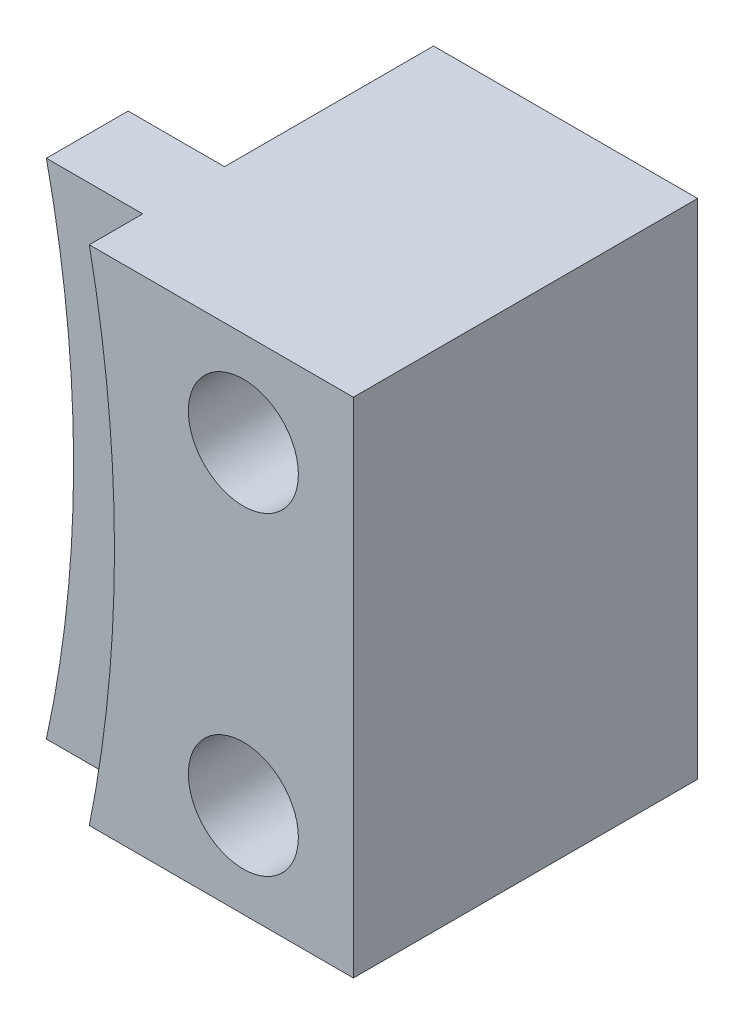
ISO-10303-21;
HEADER;
FILE_DESCRIPTION(('STEP AP214'),'2;1');
FILE_NAME('part.step','',(''),(''),'','','');
FILE_SCHEMA(('AUTOMOTIVE_DESIGN { 1 0 10303 214 1 1 1 1 }'));
ENDSEC;
DATA;
#1=APPLICATION_CONTEXT('core data for automotive mechanical design processes');
#2=APPLICATION_PROTOCOL_DEFINITION('international standard','automotive_design',2000,#1);
#3=PRODUCT_CONTEXT('',#1,'mechanical');
#4=PRODUCT('Part','Part','',(#3));
#5=PRODUCT_RELATED_PRODUCT_CATEGORY('part','',(#4));
#6=PRODUCT_DEFINITION_FORMATION('','',#4);
#7=PRODUCT_DEFINITION_CONTEXT('part definition',#1,'design');
#8=PRODUCT_DEFINITION('design','',#6,#7);
#9=PRODUCT_DEFINITION_SHAPE('','',#8);
#10=(LENGTH_UNIT() NAMED_UNIT(*) SI_UNIT(.MILLI.,.METRE.));
#11=(NAMED_UNIT(*) PLANE_ANGLE_UNIT() SI_UNIT($,.RADIAN.));
#12=(NAMED_UNIT(*) SI_UNIT($,.STERADIAN.) SOLID_ANGLE_UNIT());
#13=UNCERTAINTY_MEASURE_WITH_UNIT(LENGTH_MEASURE(1.E-05),#10,'distance_accuracy_value','');
#14=(GEOMETRIC_REPRESENTATION_CONTEXT(3) GLOBAL_UNCERTAINTY_ASSIGNED_CONTEXT((#13)) GLOBAL_UNIT_ASSIGNED_CONTEXT((#10,
#11,#12)) REPRESENTATION_CONTEXT('',''));
#15=CARTESIAN_POINT('',(0.,0.,0.));
#16=DIRECTION('',(0.,0.,1.));
#17=DIRECTION('',(1.,0.,0.));
#18=AXIS2_PLACEMENT_3D('',#15,#16,#17);
#19=CARTESIAN_POINT('',(44.5,5.,46.));
#20=DIRECTION('',(0.,0.,1.));
#21=DIRECTION('',(1.,0.,0.));
#22=AXIS2_PLACEMENT_3D('',#19,#20,#21);
#23=CYLINDRICAL_SURFACE('',#22,1.75);
#24=DIRECTION('',(0.,0.,1.));
#25=VECTOR('',#24,1.);
#26=CARTESIAN_POINT('',(46.25,5.,46.));
#27=LINE('',#26,#25);
#28=CARTESIAN_POINT('',(46.25,5.,46.05));
#29=VERTEX_POINT('',#28);
#30=CARTESIAN_POINT('',(46.25,5.,57.));
#31=VERTEX_POINT('',#30);
#32=EDGE_CURVE('E10',#29,#31,#27,.T.);
#33=ORIENTED_EDGE('',*,*,#32,.F.);
#34=CARTESIAN_POINT('',(44.5,5.,46.05));
#35=DIRECTION('',(0.,0.,1.));
#36=DIRECTION('',(1.,0.,0.));
#37=AXIS2_PLACEMENT_3D('',#34,#35,#36);
#38=CIRCLE('',#37,1.75);
#39=EDGE_CURVE('E183',#29,#29,#38,.T.);
#40=ORIENTED_EDGE('',*,*,#39,.F.);
#41=ORIENTED_EDGE('',*,*,#32,.T.);
#42=CARTESIAN_POINT('',(44.5,5.,57.));
#43=DIRECTION('',(0.,0.,1.));
#44=DIRECTION('',(1.,0.,0.));
#45=AXIS2_PLACEMENT_3D('',#42,#43,#44);
#46=CIRCLE('',#45,1.75);
#47=EDGE_CURVE('E226',#31,#31,#46,.T.);
#48=ORIENTED_EDGE('',*,*,#47,.T.);
#49=EDGE_LOOP('',(#33,#40,#41,#48));
#50=FACE_BOUND('',#49,.T.);
#51=ADVANCED_FACE('F15',(#50),#23,.F.);
#52=CARTESIAN_POINT('',(44.5,-5.,46.));
#53=DIRECTION('',(0.,0.,1.));
#54=DIRECTION('',(1.,0.,0.));
#55=AXIS2_PLACEMENT_3D('',#52,#53,#54);
#56=CYLINDRICAL_SURFACE('',#55,1.75);
#57=DIRECTION('',(0.,0.,1.));
#58=VECTOR('',#57,1.);
#59=CARTESIAN_POINT('',(46.25,-5.,46.));
#60=LINE('',#59,#58);
#61=CARTESIAN_POINT('',(46.25,-5.,46.05));
#62=VERTEX_POINT('',#61);
#63=CARTESIAN_POINT('',(46.25,-5.,57.));
#64=VERTEX_POINT('',#63);
#65=EDGE_CURVE('E18',#62,#64,#60,.T.);
#66=ORIENTED_EDGE('',*,*,#65,.F.);
#67=CARTESIAN_POINT('',(44.5,-5.,46.05));
#68=DIRECTION('',(0.,0.,1.));
#69=DIRECTION('',(1.,0.,0.));
#70=AXIS2_PLACEMENT_3D('',#67,#68,#69);
#71=CIRCLE('',#70,1.75);
#72=EDGE_CURVE('E177',#62,#62,#71,.T.);
#73=ORIENTED_EDGE('',*,*,#72,.F.);
#74=ORIENTED_EDGE('',*,*,#65,.T.);
#75=CARTESIAN_POINT('',(44.5,-5.,57.));
#76=DIRECTION('',(0.,0.,1.));
#77=DIRECTION('',(1.,0.,0.));
#78=AXIS2_PLACEMENT_3D('',#75,#76,#77);
#79=CIRCLE('',#78,1.75);
#80=EDGE_CURVE('E223',#64,#64,#79,.T.);
#81=ORIENTED_EDGE('',*,*,#80,.T.);
#82=EDGE_LOOP('',(#66,#73,#74,#81));
#83=FACE_BOUND('',#82,.T.);
#84=ADVANCED_FACE('F307',(#83),#56,.F.);
#85=CARTESIAN_POINT('',(38.,8.,46.05));
#86=DIRECTION('',(0.,1.,0.));
#87=DIRECTION('',(1.,0.,0.));
#88=AXIS2_PLACEMENT_3D('',#85,#86,#87);
#89=PLANE('',#88);
#90=DIRECTION('',(1.,0.,0.));
#91=VECTOR('',#90,1.);
#92=CARTESIAN_POINT('',(38.,8.,46.05));
#93=LINE('',#92,#91);
#94=CARTESIAN_POINT('',(39.6,8.,46.05));
#95=VERTEX_POINT('',#94);
#96=CARTESIAN_POINT('',(48.,8.,46.05));
#97=VERTEX_POINT('',#96);
#98=EDGE_CURVE('E124',#95,#97,#93,.T.);
#99=ORIENTED_EDGE('',*,*,#98,.F.);
#100=DIRECTION('',(0.,0.,1.));
#101=VECTOR('',#100,1.);
#102=CARTESIAN_POINT('',(39.6,8.,46.));
#103=LINE('',#102,#101);
#104=CARTESIAN_POINT('',(39.6,8.,52.7));
#105=VERTEX_POINT('',#104);
#106=EDGE_CURVE('E160',#95,#105,#103,.T.);
#107=ORIENTED_EDGE('',*,*,#106,.T.);
#108=DIRECTION('',(1.,0.,0.));
#109=VECTOR('',#108,1.);
#110=CARTESIAN_POINT('',(30.,8.,52.7));
#111=LINE('',#110,#109);
#112=CARTESIAN_POINT('',(36.53436738196,8.,52.7));
#113=VERTEX_POINT('',#112);
#114=EDGE_CURVE('E192',#113,#105,#111,.T.);
#115=ORIENTED_EDGE('',*,*,#114,.F.);
#116=DIRECTION('',(0.,0.,1.));
#117=VECTOR('',#116,1.);
#118=CARTESIAN_POINT('',(36.53436738196,8.,51.7));
#119=LINE('',#118,#117);
#120=CARTESIAN_POINT('',(36.53436738196,8.,55.3));
#121=VERTEX_POINT('',#120);
#122=EDGE_CURVE('E174',#113,#121,#119,.T.);
#123=ORIENTED_EDGE('',*,*,#122,.T.);
#124=DIRECTION('',(1.,0.,0.));
#125=VECTOR('',#124,1.);
#126=CARTESIAN_POINT('',(30.,8.,55.3));
#127=LINE('',#126,#125);
#128=CARTESIAN_POINT('',(39.6,8.,55.3));
#129=VERTEX_POINT('',#128);
#130=EDGE_CURVE('E173',#121,#129,#127,.T.);
#131=ORIENTED_EDGE('',*,*,#130,.T.);
#132=DIRECTION('',(0.,0.,1.));
#133=VECTOR('',#132,1.);
#134=CARTESIAN_POINT('',(39.6,8.,46.));
#135=LINE('',#134,#133);
#136=CARTESIAN_POINT('',(39.6,8.,57.));
#137=VERTEX_POINT('',#136);
#138=EDGE_CURVE('E213',#129,#137,#135,.T.);
#139=ORIENTED_EDGE('',*,*,#138,.T.);
#140=DIRECTION('',(1.,0.,0.));
#141=VECTOR('',#140,1.);
#142=CARTESIAN_POINT('',(38.,8.,57.));
#143=LINE('',#142,#141);
#144=CARTESIAN_POINT('',(48.,8.,57.));
#145=VERTEX_POINT('',#144);
#146=EDGE_CURVE('E217',#137,#145,#143,.T.);
#147=ORIENTED_EDGE('',*,*,#146,.T.);
#148=DIRECTION('',(0.,0.,1.));
#149=VECTOR('',#148,1.);
#150=CARTESIAN_POINT('',(48.,8.,46.05));
#151=LINE('',#150,#149);
#152=EDGE_CURVE('E228',#97,#145,#151,.T.);
#153=ORIENTED_EDGE('',*,*,#152,.F.);
#154=EDGE_LOOP('',(#99,#107,#115,#123,#131,#139,#147,#153));
#155=FACE_BOUND('',#154,.T.);
#156=ADVANCED_FACE('F312',(#155),#89,.T.);
#157=CARTESIAN_POINT('',(48.,-8.,46.05));
#158=DIRECTION('',(1.,0.,0.));
#159=DIRECTION('',(0.,1.,0.));
#160=AXIS2_PLACEMENT_3D('',#157,#158,#159);
#161=PLANE('',#160);
#162=DIRECTION('',(0.,0.,1.));
#163=VECTOR('',#162,1.);
#164=CARTESIAN_POINT('',(48.,-8.,46.05));
#165=LINE('',#164,#163);
#166=CARTESIAN_POINT('',(48.,-8.,46.05));
#167=VERTEX_POINT('',#166);
#168=CARTESIAN_POINT('',(48.,-8.,57.));
#169=VERTEX_POINT('',#168);
#170=EDGE_CURVE('E134',#167,#169,#165,.T.);
#171=ORIENTED_EDGE('',*,*,#170,.F.);
#172=DIRECTION('',(0.,1.,0.));
#173=VECTOR('',#172,1.);
#174=CARTESIAN_POINT('',(48.,-8.,46.05));
#175=LINE('',#174,#173);
#176=EDGE_CURVE('E117',#167,#97,#175,.T.);
#177=ORIENTED_EDGE('',*,*,#176,.T.);
#178=ORIENTED_EDGE('',*,*,#152,.T.);
#179=DIRECTION('',(0.,1.,0.));
#180=VECTOR('',#179,1.);
#181=CARTESIAN_POINT('',(48.,-8.,57.));
#182=LINE('',#181,#180);
#183=EDGE_CURVE('E142',#169,#145,#182,.T.);
#184=ORIENTED_EDGE('',*,*,#183,.F.);
#185=EDGE_LOOP('',(#171,#177,#178,#184));
#186=FACE_BOUND('',#185,.T.);
#187=ADVANCED_FACE('F140',(#186),#161,.T.);
#188=CARTESIAN_POINT('',(38.,-8.,57.));
#189=DIRECTION('',(0.,0.,1.));
#190=DIRECTION('',(1.,0.,0.));
#191=AXIS2_PLACEMENT_3D('',#188,#189,#190);
#192=PLANE('',#191);
#193=ORIENTED_EDGE('',*,*,#47,.F.);
#194=EDGE_LOOP('',(#193));
#195=FACE_BOUND('',#194,.T.);
#196=ORIENTED_EDGE('',*,*,#80,.F.);
#197=EDGE_LOOP('',(#196));
#198=FACE_BOUND('',#197,.T.);
#199=ORIENTED_EDGE('',*,*,#146,.F.);
#200=CARTESIAN_POINT('',(0.,0.,57.));
#201=DIRECTION('',(0.,0.,-1.));
#202=DIRECTION('',(0.980198019802019,0.198019801980004,0.));
#203=AXIS2_PLACEMENT_3D('',#200,#201,#202);
#204=CIRCLE('',#203,40.4);
#205=CARTESIAN_POINT('',(39.6,-8.,57.));
#206=VERTEX_POINT('',#205);
#207=EDGE_CURVE('E210',#137,#206,#204,.T.);
#208=ORIENTED_EDGE('',*,*,#207,.T.);
#209=DIRECTION('',(1.,0.,0.));
#210=VECTOR('',#209,1.);
#211=CARTESIAN_POINT('',(38.,-8.,57.));
#212=LINE('',#211,#210);
#213=EDGE_CURVE('E145',#206,#169,#212,.T.);
#214=ORIENTED_EDGE('',*,*,#213,.T.);
#215=ORIENTED_EDGE('',*,*,#183,.T.);
#216=EDGE_LOOP('',(#199,#208,#214,#215));
#217=FACE_BOUND('',#216,.T.);
#218=ADVANCED_FACE('F290',(#195,#198,#217),#192,.T.);
#219=CARTESIAN_POINT('',(0.,0.,46.));
#220=DIRECTION('',(0.,0.,1.));
#221=DIRECTION('',(1.,0.,0.));
#222=AXIS2_PLACEMENT_3D('',#219,#220,#221);
#223=CYLINDRICAL_SURFACE('',#222,40.4);
#224=ORIENTED_EDGE('',*,*,#207,.F.);
#225=ORIENTED_EDGE('',*,*,#138,.F.);
#226=CARTESIAN_POINT('',(0.,0.,55.3));
#227=DIRECTION('',(0.,0.,1.));
#228=DIRECTION('',(1.,0.,0.));
#229=AXIS2_PLACEMENT_3D('',#226,#227,#228);
#230=CIRCLE('',#229,40.4);
#231=CARTESIAN_POINT('',(39.6,-8.,55.3));
#232=VERTEX_POINT('',#231);
#233=EDGE_CURVE('E169',#232,#129,#230,.T.);
#234=ORIENTED_EDGE('',*,*,#233,.F.);
#235=DIRECTION('',(0.,0.,1.));
#236=VECTOR('',#235,1.);
#237=CARTESIAN_POINT('',(39.6,-8.,46.));
#238=LINE('',#237,#236);
#239=EDGE_CURVE('E150',#232,#206,#238,.T.);
#240=ORIENTED_EDGE('',*,*,#239,.T.);
#241=EDGE_LOOP('',(#224,#225,#234,#240));
#242=FACE_BOUND('',#241,.T.);
#243=ADVANCED_FACE('F284',(#242),#223,.F.);
#244=CARTESIAN_POINT('',(0.,0.,55.3));
#245=DIRECTION('',(0.,0.,1.));
#246=DIRECTION('',(1.,0.,0.));
#247=AXIS2_PLACEMENT_3D('',#244,#245,#246);
#248=PLANE('',#247);
#249=DIRECTION('',(1.,0.,0.));
#250=VECTOR('',#249,1.);
#251=CARTESIAN_POINT('',(30.,-8.,55.3));
#252=LINE('',#251,#250);
#253=CARTESIAN_POINT('',(36.53436738196,-8.,55.3));
#254=VERTEX_POINT('',#253);
#255=EDGE_CURVE('E158',#254,#232,#252,.T.);
#256=ORIENTED_EDGE('',*,*,#255,.T.);
#257=ORIENTED_EDGE('',*,*,#233,.T.);
#258=ORIENTED_EDGE('',*,*,#130,.F.);
#259=CARTESIAN_POINT('',(0.,0.,55.3));
#260=DIRECTION('',(0.,0.,-1.));
#261=DIRECTION('',(0.976854742833037,0.213903743316008,0.));
#262=AXIS2_PLACEMENT_3D('',#259,#260,#261);
#263=CIRCLE('',#262,37.4);
#264=EDGE_CURVE('E201',#121,#254,#263,.T.);
#265=ORIENTED_EDGE('',*,*,#264,.T.);
#266=EDGE_LOOP('',(#256,#257,#258,#265));
#267=FACE_BOUND('',#266,.T.);
#268=ADVANCED_FACE('F275',(#267),#248,.T.);
#269=CARTESIAN_POINT('',(0.,0.,51.7));
#270=DIRECTION('',(0.,0.,1.));
#271=DIRECTION('',(1.,0.,0.));
#272=AXIS2_PLACEMENT_3D('',#269,#270,#271);
#273=CYLINDRICAL_SURFACE('',#272,37.4);
#274=DIRECTION('',(0.,0.,1.));
#275=VECTOR('',#274,1.);
#276=CARTESIAN_POINT('',(36.53436738196,-8.,51.7));
#277=LINE('',#276,#275);
#278=CARTESIAN_POINT('',(36.53436738196,-8.,52.7));
#279=VERTEX_POINT('',#278);
#280=EDGE_CURVE('E155',#279,#254,#277,.T.);
#281=ORIENTED_EDGE('',*,*,#280,.T.);
#282=ORIENTED_EDGE('',*,*,#264,.F.);
#283=ORIENTED_EDGE('',*,*,#122,.F.);
#284=CARTESIAN_POINT('',(0.,0.,52.7));
#285=DIRECTION('',(0.,0.,1.));
#286=DIRECTION('',(0.976854742833037,-0.213903743316008,0.));
#287=AXIS2_PLACEMENT_3D('',#284,#285,#286);
#288=CIRCLE('',#287,37.4);
#289=EDGE_CURVE('E164',#279,#113,#288,.T.);
#290=ORIENTED_EDGE('',*,*,#289,.F.);
#291=EDGE_LOOP('',(#281,#282,#283,#290));
#292=FACE_BOUND('',#291,.T.);
#293=ADVANCED_FACE('F242',(#292),#273,.F.);
#294=CARTESIAN_POINT('',(0.,0.,52.7));
#295=DIRECTION('',(0.,0.,1.));
#296=DIRECTION('',(1.,0.,0.));
#297=AXIS2_PLACEMENT_3D('',#294,#295,#296);
#298=PLANE('',#297);
#299=ORIENTED_EDGE('',*,*,#289,.T.);
#300=ORIENTED_EDGE('',*,*,#114,.T.);
#301=CARTESIAN_POINT('',(0.,0.,52.7));
#302=DIRECTION('',(0.,0.,1.));
#303=DIRECTION('',(1.,0.,0.));
#304=AXIS2_PLACEMENT_3D('',#301,#302,#303);
#305=CIRCLE('',#304,40.4);
#306=CARTESIAN_POINT('',(39.6,-8.,52.7));
#307=VERTEX_POINT('',#306);
#308=EDGE_CURVE('E165',#307,#105,#305,.T.);
#309=ORIENTED_EDGE('',*,*,#308,.F.);
#310=DIRECTION('',(1.,0.,0.));
#311=VECTOR('',#310,1.);
#312=CARTESIAN_POINT('',(30.,-8.,52.7));
#313=LINE('',#312,#311);
#314=EDGE_CURVE('E153',#279,#307,#313,.T.);
#315=ORIENTED_EDGE('',*,*,#314,.F.);
#316=EDGE_LOOP('',(#299,#300,#309,#315));
#317=FACE_BOUND('',#316,.T.);
#318=ADVANCED_FACE('F236',(#317),#298,.F.);
#319=CARTESIAN_POINT('',(0.,0.,46.));
#320=DIRECTION('',(0.,0.,1.));
#321=DIRECTION('',(1.,0.,0.));
#322=AXIS2_PLACEMENT_3D('',#319,#320,#321);
#323=CYLINDRICAL_SURFACE('',#322,40.4);
#324=ORIENTED_EDGE('',*,*,#308,.T.);
#325=ORIENTED_EDGE('',*,*,#106,.F.);
#326=CARTESIAN_POINT('',(0.,0.,46.05));
#327=DIRECTION('',(0.,0.,1.));
#328=DIRECTION('',(0.980198019802019,-0.198019801980004,0.));
#329=AXIS2_PLACEMENT_3D('',#326,#327,#328);
#330=CIRCLE('',#329,40.4);
#331=CARTESIAN_POINT('',(39.6,-8.,46.05));
#332=VERTEX_POINT('',#331);
#333=EDGE_CURVE('E128',#332,#95,#330,.T.);
#334=ORIENTED_EDGE('',*,*,#333,.F.);
#335=DIRECTION('',(0.,0.,1.));
#336=VECTOR('',#335,1.);
#337=CARTESIAN_POINT('',(39.6,-8.,46.));
#338=LINE('',#337,#336);
#339=EDGE_CURVE('E137',#332,#307,#338,.T.);
#340=ORIENTED_EDGE('',*,*,#339,.T.);
#341=EDGE_LOOP('',(#324,#325,#334,#340));
#342=FACE_BOUND('',#341,.T.);
#343=ADVANCED_FACE('F241',(#342),#323,.F.);
#344=CARTESIAN_POINT('',(38.,-8.,46.05));
#345=DIRECTION('',(0.,0.,1.));
#346=DIRECTION('',(1.,0.,0.));
#347=AXIS2_PLACEMENT_3D('',#344,#345,#346);
#348=PLANE('',#347);
#349=ORIENTED_EDGE('',*,*,#39,.T.);
#350=EDGE_LOOP('',(#349));
#351=FACE_BOUND('',#350,.T.);
#352=ORIENTED_EDGE('',*,*,#72,.T.);
#353=EDGE_LOOP('',(#352));
#354=FACE_BOUND('',#353,.T.);
#355=ORIENTED_EDGE('',*,*,#176,.F.);
#356=DIRECTION('',(1.,0.,0.));
#357=VECTOR('',#356,1.);
#358=CARTESIAN_POINT('',(38.,-8.,46.05));
#359=LINE('',#358,#357);
#360=EDGE_CURVE('E121',#332,#167,#359,.T.);
#361=ORIENTED_EDGE('',*,*,#360,.F.);
#362=ORIENTED_EDGE('',*,*,#333,.T.);
#363=ORIENTED_EDGE('',*,*,#98,.T.);
#364=EDGE_LOOP('',(#355,#361,#362,#363));
#365=FACE_BOUND('',#364,.T.);
#366=ADVANCED_FACE('F119',(#351,#354,#365),#348,.F.);
#367=CARTESIAN_POINT('',(38.,-8.,46.05));
#368=DIRECTION('',(0.,1.,0.));
#369=DIRECTION('',(1.,0.,0.));
#370=AXIS2_PLACEMENT_3D('',#367,#368,#369);
#371=PLANE('',#370);
#372=ORIENTED_EDGE('',*,*,#170,.T.);
#373=ORIENTED_EDGE('',*,*,#213,.F.);
#374=ORIENTED_EDGE('',*,*,#239,.F.);
#375=ORIENTED_EDGE('',*,*,#255,.F.);
#376=ORIENTED_EDGE('',*,*,#280,.F.);
#377=ORIENTED_EDGE('',*,*,#314,.T.);
#378=ORIENTED_EDGE('',*,*,#339,.F.);
#379=ORIENTED_EDGE('',*,*,#360,.T.);
#380=EDGE_LOOP('',(#372,#373,#374,#375,#376,#377,#378,#379));
#381=FACE_BOUND('',#380,.T.);
#382=ADVANCED_FACE('F132',(#381),#371,.F.);
#383=CLOSED_SHELL('',(#51,#84,#156,#187,#218,#243,#268,#293,#318,#343,#366,#382));
#384=MANIFOLD_SOLID_BREP('B1',#383);
#385=ADVANCED_BREP_SHAPE_REPRESENTATION('',(#18,#384),#14);
#386=SHAPE_DEFINITION_REPRESENTATION(#9,#385);
ENDSEC;
END-ISO-10303-21;
